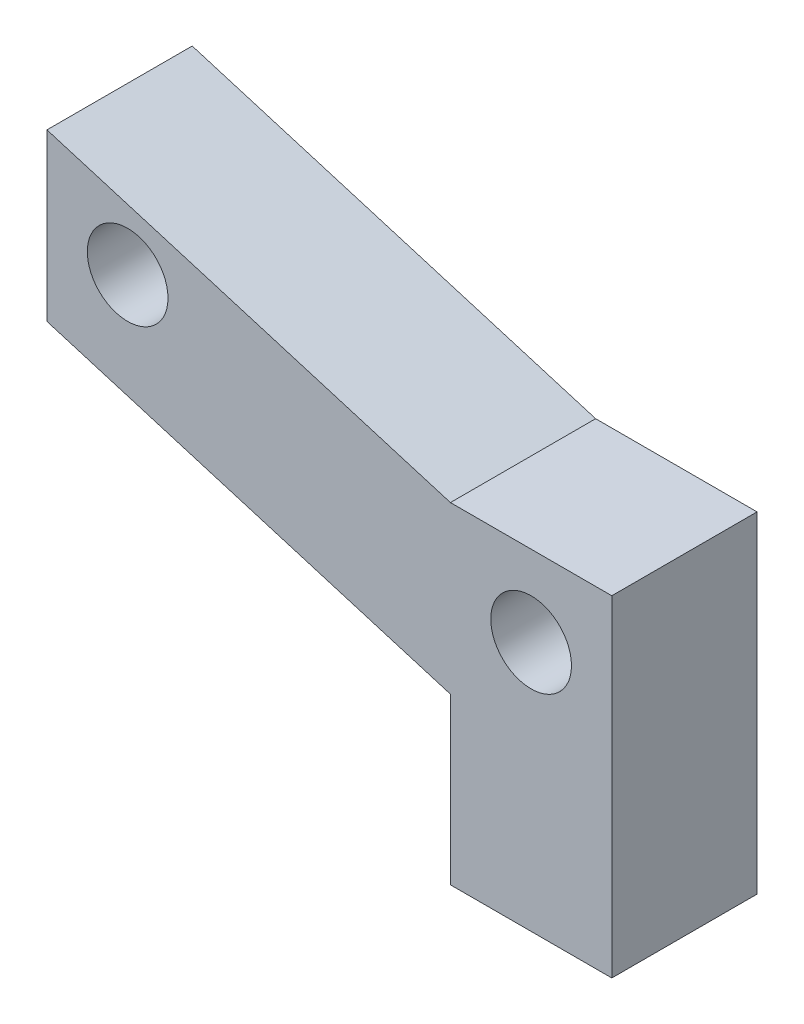
ISO-10303-21;
HEADER;
FILE_DESCRIPTION(('STEP AP214'),'2;1');
FILE_NAME('part.step','',(''),(''),'','','');
FILE_SCHEMA(('AUTOMOTIVE_DESIGN { 1 0 10303 214 1 1 1 1 }'));
ENDSEC;
DATA;
#1=APPLICATION_CONTEXT('core data for automotive mechanical design processes');
#2=APPLICATION_PROTOCOL_DEFINITION('international standard','automotive_design',2000,#1);
#3=PRODUCT_CONTEXT('',#1,'mechanical');
#4=PRODUCT('Part','Part','',(#3));
#5=PRODUCT_RELATED_PRODUCT_CATEGORY('part','',(#4));
#6=PRODUCT_DEFINITION_FORMATION('','',#4);
#7=PRODUCT_DEFINITION_CONTEXT('part definition',#1,'design');
#8=PRODUCT_DEFINITION('design','',#6,#7);
#9=PRODUCT_DEFINITION_SHAPE('','',#8);
#10=(LENGTH_UNIT() NAMED_UNIT(*) SI_UNIT(.MILLI.,.METRE.));
#11=(NAMED_UNIT(*) PLANE_ANGLE_UNIT() SI_UNIT($,.RADIAN.));
#12=(NAMED_UNIT(*) SI_UNIT($,.STERADIAN.) SOLID_ANGLE_UNIT());
#13=UNCERTAINTY_MEASURE_WITH_UNIT(LENGTH_MEASURE(1.E-05),#10,'distance_accuracy_value','');
#14=(GEOMETRIC_REPRESENTATION_CONTEXT(3) GLOBAL_UNCERTAINTY_ASSIGNED_CONTEXT((#13)) GLOBAL_UNIT_ASSIGNED_CONTEXT((#10,
#11,#12)) REPRESENTATION_CONTEXT('',''));
#15=CARTESIAN_POINT('',(0.,0.,0.));
#16=DIRECTION('',(0.,0.,1.));
#17=DIRECTION('',(1.,0.,0.));
#18=AXIS2_PLACEMENT_3D('',#15,#16,#17);
#19=CARTESIAN_POINT('',(-15.8157968304313,-97.1931579607244,9.));
#20=DIRECTION('',(-0.287347885566348,-0.957826285221151,0.));
#21=DIRECTION('',(0.957826285221151,-0.287347885566348,0.));
#22=AXIS2_PLACEMENT_3D('',#19,#20,#21);
#23=PLANE('',#22);
#24=DIRECTION('',(-0.957826285221151,0.287347885566348,0.));
#25=VECTOR('',#24,1.);
#26=CARTESIAN_POINT('',(-15.8157968304313,-97.1931579607244,0.));
#27=LINE('',#26,#25);
#28=CARTESIAN_POINT('',(9.18420316956873,-104.693157960725,0.));
#29=VERTEX_POINT('',#28);
#30=CARTESIAN_POINT('',(-15.8157968304313,-97.1931579607244,0.));
#31=VERTEX_POINT('',#30);
#32=EDGE_CURVE('E126',#29,#31,#27,.T.);
#33=ORIENTED_EDGE('',*,*,#32,.T.);
#34=DIRECTION('',(0.,0.,-1.));
#35=VECTOR('',#34,1.);
#36=CARTESIAN_POINT('',(-15.8157968304313,-97.1931579607244,9.));
#37=LINE('',#36,#35);
#38=CARTESIAN_POINT('',(-15.8157968304313,-97.1931579607244,9.));
#39=VERTEX_POINT('',#38);
#40=EDGE_CURVE('E11',#39,#31,#37,.T.);
#41=ORIENTED_EDGE('',*,*,#40,.F.);
#42=DIRECTION('',(-0.957826285221151,0.287347885566348,0.));
#43=VECTOR('',#42,1.);
#44=CARTESIAN_POINT('',(-15.8157968304313,-97.1931579607244,9.));
#45=LINE('',#44,#43);
#46=CARTESIAN_POINT('',(9.18420316956873,-104.693157960725,9.));
#47=VERTEX_POINT('',#46);
#48=EDGE_CURVE('E139',#47,#39,#45,.T.);
#49=ORIENTED_EDGE('',*,*,#48,.F.);
#50=DIRECTION('',(0.,0.,-1.));
#51=VECTOR('',#50,1.);
#52=CARTESIAN_POINT('',(9.18420316956873,-104.693157960725,9.));
#53=LINE('',#52,#51);
#54=EDGE_CURVE('E122',#47,#29,#53,.T.);
#55=ORIENTED_EDGE('',*,*,#54,.T.);
#56=EDGE_LOOP('',(#33,#41,#49,#55));
#57=FACE_BOUND('',#56,.T.);
#58=ADVANCED_FACE('F36',(#57),#23,.F.);
#59=CARTESIAN_POINT('',(-15.8157968304313,-97.1931579607244,9.));
#60=DIRECTION('',(1.,0.,0.));
#61=DIRECTION('',(0.,1.,0.));
#62=AXIS2_PLACEMENT_3D('',#59,#60,#61);
#63=PLANE('',#62);
#64=DIRECTION('',(0.,-1.,0.));
#65=VECTOR('',#64,1.);
#66=CARTESIAN_POINT('',(-15.8157968304313,-97.1931579607244,0.));
#67=LINE('',#66,#65);
#68=CARTESIAN_POINT('',(-15.8157968304313,-107.474376778641,0.));
#69=VERTEX_POINT('',#68);
#70=EDGE_CURVE('E129',#31,#69,#67,.T.);
#71=ORIENTED_EDGE('',*,*,#70,.T.);
#72=DIRECTION('',(0.,0.,-1.));
#73=VECTOR('',#72,1.);
#74=CARTESIAN_POINT('',(-15.8157968304313,-107.474376778641,9.));
#75=LINE('',#74,#73);
#76=CARTESIAN_POINT('',(-15.8157968304313,-107.474376778641,9.));
#77=VERTEX_POINT('',#76);
#78=EDGE_CURVE('E44',#77,#69,#75,.T.);
#79=ORIENTED_EDGE('',*,*,#78,.F.);
#80=DIRECTION('',(0.,-1.,0.));
#81=VECTOR('',#80,1.);
#82=CARTESIAN_POINT('',(-15.8157968304313,-97.1931579607244,9.));
#83=LINE('',#82,#81);
#84=EDGE_CURVE('E91',#39,#77,#83,.T.);
#85=ORIENTED_EDGE('',*,*,#84,.F.);
#86=ORIENTED_EDGE('',*,*,#40,.T.);
#87=EDGE_LOOP('',(#71,#79,#85,#86));
#88=FACE_BOUND('',#87,.T.);
#89=ADVANCED_FACE('F199',(#88),#63,.F.);
#90=CARTESIAN_POINT('',(-15.8157968304313,-107.474376778641,9.));
#91=DIRECTION('',(0.287347885566347,0.957826285221151,0.));
#92=DIRECTION('',(-0.957826285221151,0.287347885566347,0.));
#93=AXIS2_PLACEMENT_3D('',#90,#91,#92);
#94=PLANE('',#93);
#95=DIRECTION('',(0.957826285221151,-0.287347885566347,0.));
#96=VECTOR('',#95,1.);
#97=CARTESIAN_POINT('',(-15.8157968304313,-107.474376778641,0.));
#98=LINE('',#97,#96);
#99=CARTESIAN_POINT('',(9.18420316956873,-114.974376778641,0.));
#100=VERTEX_POINT('',#99);
#101=EDGE_CURVE('E132',#69,#100,#98,.T.);
#102=ORIENTED_EDGE('',*,*,#101,.T.);
#103=DIRECTION('',(0.,0.,-1.));
#104=VECTOR('',#103,1.);
#105=CARTESIAN_POINT('',(9.18420316956873,-114.974376778641,9.));
#106=LINE('',#105,#104);
#107=CARTESIAN_POINT('',(9.18420316956873,-114.974376778641,9.));
#108=VERTEX_POINT('',#107);
#109=EDGE_CURVE('E143',#108,#100,#106,.T.);
#110=ORIENTED_EDGE('',*,*,#109,.F.);
#111=DIRECTION('',(0.957826285221151,-0.287347885566347,0.));
#112=VECTOR('',#111,1.);
#113=CARTESIAN_POINT('',(-15.8157968304313,-107.474376778641,9.));
#114=LINE('',#113,#112);
#115=EDGE_CURVE('E151',#77,#108,#114,.T.);
#116=ORIENTED_EDGE('',*,*,#115,.F.);
#117=ORIENTED_EDGE('',*,*,#78,.T.);
#118=EDGE_LOOP('',(#102,#110,#116,#117));
#119=FACE_BOUND('',#118,.T.);
#120=ADVANCED_FACE('F149',(#119),#94,.F.);
#121=CARTESIAN_POINT('',(9.18420316956873,-114.974376778641,9.));
#122=DIRECTION('',(1.,0.,0.));
#123=DIRECTION('',(0.,0.,-1.));
#124=AXIS2_PLACEMENT_3D('',#121,#122,#123);
#125=PLANE('',#124);
#126=DIRECTION('',(0.,-1.,0.));
#127=VECTOR('',#126,1.);
#128=CARTESIAN_POINT('',(9.18420316956873,-114.974376778641,0.));
#129=LINE('',#128,#127);
#130=CARTESIAN_POINT('',(9.18420316956873,-125.206503807883,0.));
#131=VERTEX_POINT('',#130);
#132=EDGE_CURVE('E134',#100,#131,#129,.T.);
#133=ORIENTED_EDGE('',*,*,#132,.T.);
#134=DIRECTION('',(0.,0.,-1.));
#135=VECTOR('',#134,1.);
#136=CARTESIAN_POINT('',(9.18420316956873,-125.206503807883,9.));
#137=LINE('',#136,#135);
#138=CARTESIAN_POINT('',(9.18420316956873,-125.206503807883,9.));
#139=VERTEX_POINT('',#138);
#140=EDGE_CURVE('E117',#139,#131,#137,.T.);
#141=ORIENTED_EDGE('',*,*,#140,.F.);
#142=DIRECTION('',(0.,-1.,0.));
#143=VECTOR('',#142,1.);
#144=CARTESIAN_POINT('',(9.18420316956873,-114.974376778641,9.));
#145=LINE('',#144,#143);
#146=EDGE_CURVE('E107',#108,#139,#145,.T.);
#147=ORIENTED_EDGE('',*,*,#146,.F.);
#148=ORIENTED_EDGE('',*,*,#109,.T.);
#149=EDGE_LOOP('',(#133,#141,#147,#148));
#150=FACE_BOUND('',#149,.T.);
#151=ADVANCED_FACE('F157',(#150),#125,.F.);
#152=CARTESIAN_POINT('',(19.1842031695687,-125.206503807883,9.));
#153=DIRECTION('',(0.,1.,0.));
#154=DIRECTION('',(0.,0.,1.));
#155=AXIS2_PLACEMENT_3D('',#152,#153,#154);
#156=PLANE('',#155);
#157=DIRECTION('',(1.,0.,0.));
#158=VECTOR('',#157,1.);
#159=CARTESIAN_POINT('',(19.1842031695687,-125.206503807883,0.));
#160=LINE('',#159,#158);
#161=CARTESIAN_POINT('',(19.1842031695687,-125.206503807883,0.));
#162=VERTEX_POINT('',#161);
#163=EDGE_CURVE('E116',#131,#162,#160,.T.);
#164=ORIENTED_EDGE('',*,*,#163,.T.);
#165=DIRECTION('',(0.,0.,-1.));
#166=VECTOR('',#165,1.);
#167=CARTESIAN_POINT('',(19.1842031695687,-125.206503807883,9.));
#168=LINE('',#167,#166);
#169=CARTESIAN_POINT('',(19.1842031695687,-125.206503807883,9.));
#170=VERTEX_POINT('',#169);
#171=EDGE_CURVE('E113',#170,#162,#168,.T.);
#172=ORIENTED_EDGE('',*,*,#171,.F.);
#173=DIRECTION('',(1.,0.,0.));
#174=VECTOR('',#173,1.);
#175=CARTESIAN_POINT('',(19.1842031695687,-125.206503807883,9.));
#176=LINE('',#175,#174);
#177=EDGE_CURVE('E101',#139,#170,#176,.T.);
#178=ORIENTED_EDGE('',*,*,#177,.F.);
#179=ORIENTED_EDGE('',*,*,#140,.T.);
#180=EDGE_LOOP('',(#164,#172,#178,#179));
#181=FACE_BOUND('',#180,.T.);
#182=ADVANCED_FACE('F114',(#181),#156,.F.);
#183=CARTESIAN_POINT('',(19.1842031695687,-114.974376778641,9.));
#184=DIRECTION('',(-1.,0.,0.));
#185=DIRECTION('',(0.,0.,1.));
#186=AXIS2_PLACEMENT_3D('',#183,#184,#185);
#187=PLANE('',#186);
#188=DIRECTION('',(0.,1.,0.));
#189=VECTOR('',#188,1.);
#190=CARTESIAN_POINT('',(19.1842031695687,-114.974376778641,0.));
#191=LINE('',#190,#189);
#192=CARTESIAN_POINT('',(19.1842031695687,-104.693157960725,0.));
#193=VERTEX_POINT('',#192);
#194=EDGE_CURVE('E77',#162,#193,#191,.T.);
#195=ORIENTED_EDGE('',*,*,#194,.T.);
#196=DIRECTION('',(0.,0.,-1.));
#197=VECTOR('',#196,1.);
#198=CARTESIAN_POINT('',(19.1842031695687,-104.693157960725,9.));
#199=LINE('',#198,#197);
#200=CARTESIAN_POINT('',(19.1842031695687,-104.693157960725,9.));
#201=VERTEX_POINT('',#200);
#202=EDGE_CURVE('E118',#201,#193,#199,.T.);
#203=ORIENTED_EDGE('',*,*,#202,.F.);
#204=DIRECTION('',(0.,1.,0.));
#205=VECTOR('',#204,1.);
#206=CARTESIAN_POINT('',(19.1842031695687,-114.974376778641,9.));
#207=LINE('',#206,#205);
#208=EDGE_CURVE('E105',#170,#201,#207,.T.);
#209=ORIENTED_EDGE('',*,*,#208,.F.);
#210=ORIENTED_EDGE('',*,*,#171,.T.);
#211=EDGE_LOOP('',(#195,#203,#209,#210));
#212=FACE_BOUND('',#211,.T.);
#213=ADVANCED_FACE('F120',(#212),#187,.F.);
#214=CARTESIAN_POINT('',(9.18420316956873,-104.693157960725,9.));
#215=DIRECTION('',(0.,-1.,0.));
#216=DIRECTION('',(0.,0.,-1.));
#217=AXIS2_PLACEMENT_3D('',#214,#215,#216);
#218=PLANE('',#217);
#219=DIRECTION('',(-1.,0.,0.));
#220=VECTOR('',#219,1.);
#221=CARTESIAN_POINT('',(9.18420316956873,-104.693157960725,0.));
#222=LINE('',#221,#220);
#223=EDGE_CURVE('E83',#193,#29,#222,.T.);
#224=ORIENTED_EDGE('',*,*,#223,.T.);
#225=ORIENTED_EDGE('',*,*,#54,.F.);
#226=DIRECTION('',(-1.,0.,0.));
#227=VECTOR('',#226,1.);
#228=CARTESIAN_POINT('',(9.18420316956873,-104.693157960725,9.));
#229=LINE('',#228,#227);
#230=EDGE_CURVE('E52',#201,#47,#229,.T.);
#231=ORIENTED_EDGE('',*,*,#230,.F.);
#232=ORIENTED_EDGE('',*,*,#202,.T.);
#233=EDGE_LOOP('',(#224,#225,#231,#232));
#234=FACE_BOUND('',#233,.T.);
#235=ADVANCED_FACE('F185',(#234),#218,.F.);
#236=CARTESIAN_POINT('',(0.,0.,9.));
#237=DIRECTION('',(0.,0.,1.));
#238=DIRECTION('',(1.,0.,0.));
#239=AXIS2_PLACEMENT_3D('',#236,#237,#238);
#240=PLANE('',#239);
#241=CARTESIAN_POINT('',(14.1842031695687,-109.693157960725,9.));
#242=DIRECTION('',(0.,0.,1.));
#243=DIRECTION('',(1.,0.,0.));
#244=AXIS2_PLACEMENT_3D('',#241,#242,#243);
#245=CIRCLE('',#244,2.5);
#246=CARTESIAN_POINT('',(16.6842031695687,-109.693157960725,9.));
#247=VERTEX_POINT('',#246);
#248=EDGE_CURVE('E168',#247,#247,#245,.T.);
#249=ORIENTED_EDGE('',*,*,#248,.F.);
#250=EDGE_LOOP('',(#249));
#251=FACE_BOUND('',#250,.T.);
#252=CARTESIAN_POINT('',(-10.8157968304313,-102.474376778641,9.));
#253=DIRECTION('',(0.,0.,1.));
#254=DIRECTION('',(1.,0.,0.));
#255=AXIS2_PLACEMENT_3D('',#252,#253,#254);
#256=CIRCLE('',#255,2.5);
#257=CARTESIAN_POINT('',(-8.31579683043127,-102.474376778641,9.));
#258=VERTEX_POINT('',#257);
#259=EDGE_CURVE('E162',#258,#258,#256,.T.);
#260=ORIENTED_EDGE('',*,*,#259,.F.);
#261=EDGE_LOOP('',(#260));
#262=FACE_BOUND('',#261,.T.);
#263=ORIENTED_EDGE('',*,*,#48,.T.);
#264=ORIENTED_EDGE('',*,*,#84,.T.);
#265=ORIENTED_EDGE('',*,*,#115,.T.);
#266=ORIENTED_EDGE('',*,*,#146,.T.);
#267=ORIENTED_EDGE('',*,*,#177,.T.);
#268=ORIENTED_EDGE('',*,*,#208,.T.);
#269=ORIENTED_EDGE('',*,*,#230,.T.);
#270=EDGE_LOOP('',(#263,#264,#265,#266,#267,#268,#269));
#271=FACE_BOUND('',#270,.T.);
#272=ADVANCED_FACE('F103',(#251,#262,#271),#240,.T.);
#273=CARTESIAN_POINT('',(0.,0.,0.));
#274=DIRECTION('',(0.,0.,1.));
#275=DIRECTION('',(1.,0.,0.));
#276=AXIS2_PLACEMENT_3D('',#273,#274,#275);
#277=PLANE('',#276);
#278=CARTESIAN_POINT('',(14.1842031695687,-109.693157960725,0.));
#279=DIRECTION('',(0.,0.,1.));
#280=DIRECTION('',(1.,0.,0.));
#281=AXIS2_PLACEMENT_3D('',#278,#279,#280);
#282=CIRCLE('',#281,2.5);
#283=CARTESIAN_POINT('',(16.6842031695687,-109.693157960725,0.));
#284=VERTEX_POINT('',#283);
#285=EDGE_CURVE('E130',#284,#284,#282,.T.);
#286=ORIENTED_EDGE('',*,*,#285,.T.);
#287=EDGE_LOOP('',(#286));
#288=FACE_BOUND('',#287,.T.);
#289=CARTESIAN_POINT('',(-10.8157968304313,-102.474376778641,0.));
#290=DIRECTION('',(0.,0.,1.));
#291=DIRECTION('',(1.,0.,0.));
#292=AXIS2_PLACEMENT_3D('',#289,#290,#291);
#293=CIRCLE('',#292,2.5);
#294=CARTESIAN_POINT('',(-8.31579683043127,-102.474376778641,0.));
#295=VERTEX_POINT('',#294);
#296=EDGE_CURVE('E165',#295,#295,#293,.T.);
#297=ORIENTED_EDGE('',*,*,#296,.T.);
#298=EDGE_LOOP('',(#297));
#299=FACE_BOUND('',#298,.T.);
#300=ORIENTED_EDGE('',*,*,#32,.F.);
#301=ORIENTED_EDGE('',*,*,#223,.F.);
#302=ORIENTED_EDGE('',*,*,#194,.F.);
#303=ORIENTED_EDGE('',*,*,#163,.F.);
#304=ORIENTED_EDGE('',*,*,#132,.F.);
#305=ORIENTED_EDGE('',*,*,#101,.F.);
#306=ORIENTED_EDGE('',*,*,#70,.F.);
#307=EDGE_LOOP('',(#300,#301,#302,#303,#304,#305,#306));
#308=FACE_BOUND('',#307,.T.);
#309=ADVANCED_FACE('F155',(#288,#299,#308),#277,.F.);
#310=CARTESIAN_POINT('',(-10.8157968304313,-102.474376778641,0.));
#311=DIRECTION('',(0.,0.,1.));
#312=DIRECTION('',(1.,0.,0.));
#313=AXIS2_PLACEMENT_3D('',#310,#311,#312);
#314=CYLINDRICAL_SURFACE('',#313,2.5);
#315=ORIENTED_EDGE('',*,*,#296,.F.);
#316=EDGE_LOOP('',(#315));
#317=FACE_BOUND('',#316,.T.);
#318=ORIENTED_EDGE('',*,*,#259,.T.);
#319=EDGE_LOOP('',(#318));
#320=FACE_BOUND('',#319,.T.);
#321=ADVANCED_FACE('F179',(#317,#320),#314,.F.);
#322=CARTESIAN_POINT('',(14.1842031695687,-109.693157960725,0.));
#323=DIRECTION('',(0.,0.,1.));
#324=DIRECTION('',(1.,0.,0.));
#325=AXIS2_PLACEMENT_3D('',#322,#323,#324);
#326=CYLINDRICAL_SURFACE('',#325,2.5);
#327=ORIENTED_EDGE('',*,*,#285,.F.);
#328=EDGE_LOOP('',(#327));
#329=FACE_BOUND('',#328,.T.);
#330=ORIENTED_EDGE('',*,*,#248,.T.);
#331=EDGE_LOOP('',(#330));
#332=FACE_BOUND('',#331,.T.);
#333=ADVANCED_FACE('F176',(#329,#332),#326,.F.);
#334=CLOSED_SHELL('',(#58,#89,#120,#151,#182,#213,#235,#272,#309,#321,#333));
#335=MANIFOLD_SOLID_BREP('B2',#334);
#336=ADVANCED_BREP_SHAPE_REPRESENTATION('',(#18,#335),#14);
#337=SHAPE_DEFINITION_REPRESENTATION(#9,#336);
ENDSEC;
END-ISO-10303-21;
